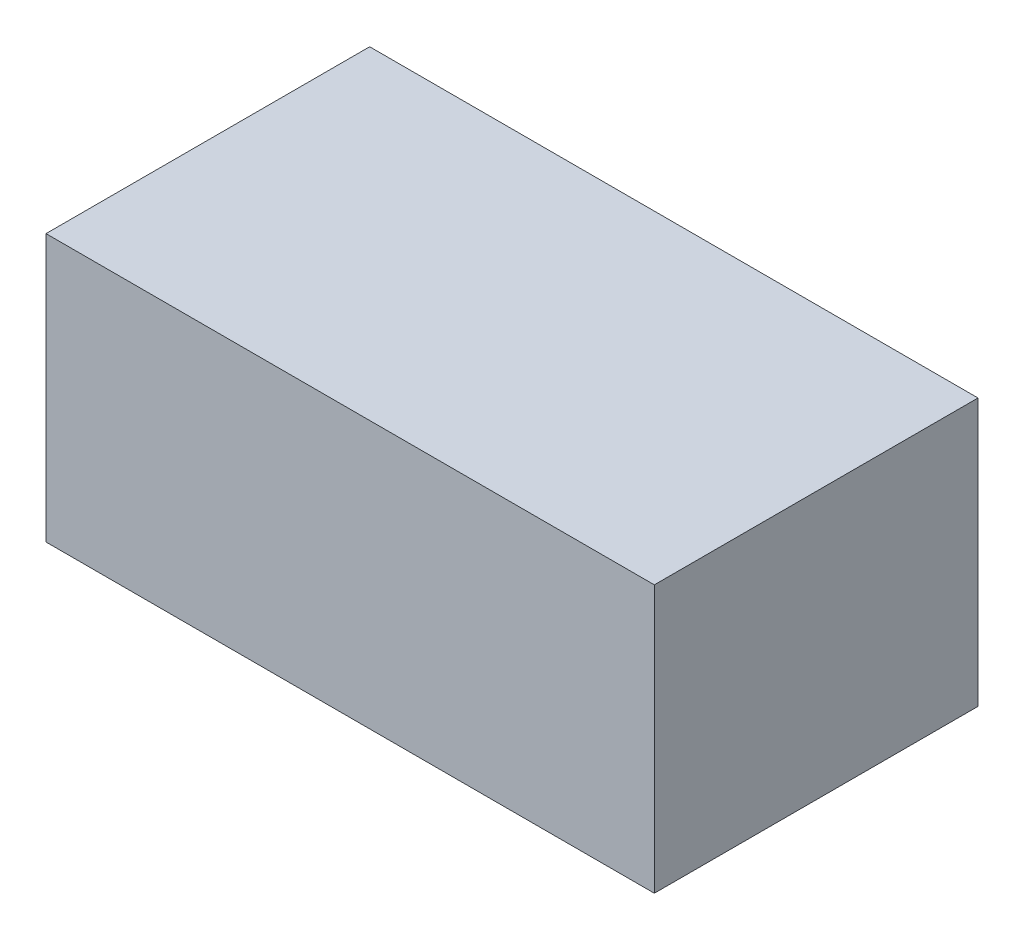
ISO-10303-21;
HEADER;
FILE_DESCRIPTION(('STEP AP214'),'2;1');
FILE_NAME('part.step','',(''),(''),'','','');
FILE_SCHEMA(('AUTOMOTIVE_DESIGN { 1 0 10303 214 1 1 1 1 }'));
ENDSEC;
DATA;
#1=APPLICATION_CONTEXT('core data for automotive mechanical design processes');
#2=APPLICATION_PROTOCOL_DEFINITION('international standard','automotive_design',2000,#1);
#3=PRODUCT_CONTEXT('',#1,'mechanical');
#4=PRODUCT('Part','Part','',(#3));
#5=PRODUCT_RELATED_PRODUCT_CATEGORY('part','',(#4));
#6=PRODUCT_DEFINITION_FORMATION('','',#4);
#7=PRODUCT_DEFINITION_CONTEXT('part definition',#1,'design');
#8=PRODUCT_DEFINITION('design','',#6,#7);
#9=PRODUCT_DEFINITION_SHAPE('','',#8);
#10=(LENGTH_UNIT() NAMED_UNIT(*) SI_UNIT(.MILLI.,.METRE.));
#11=(NAMED_UNIT(*) PLANE_ANGLE_UNIT() SI_UNIT($,.RADIAN.));
#12=(NAMED_UNIT(*) SI_UNIT($,.STERADIAN.) SOLID_ANGLE_UNIT());
#13=UNCERTAINTY_MEASURE_WITH_UNIT(LENGTH_MEASURE(1.E-05),#10,'distance_accuracy_value','');
#14=(GEOMETRIC_REPRESENTATION_CONTEXT(3) GLOBAL_UNCERTAINTY_ASSIGNED_CONTEXT((#13)) GLOBAL_UNIT_ASSIGNED_CONTEXT((#10,
#11,#12)) REPRESENTATION_CONTEXT('',''));
#15=CARTESIAN_POINT('',(0.,0.,0.));
#16=DIRECTION('',(0.,0.,1.));
#17=DIRECTION('',(1.,0.,0.));
#18=AXIS2_PLACEMENT_3D('',#15,#16,#17);
#19=CARTESIAN_POINT('',(14.2347417502107,18.75,-7.57332962138085));
#20=DIRECTION('',(0.,0.,-1.));
#21=DIRECTION('',(-1.,0.,0.));
#22=AXIS2_PLACEMENT_3D('',#19,#20,#21);
#23=PLANE('',#22);
#24=DIRECTION('',(1.,0.,0.));
#25=VECTOR('',#24,1.);
#26=CARTESIAN_POINT('',(14.2347417502107,6.25,-7.57332962138085));
#27=LINE('',#26,#25);
#28=CARTESIAN_POINT('',(14.2347417502107,6.25,-7.57332962138085));
#29=VERTEX_POINT('',#28);
#30=CARTESIAN_POINT('',(42.7042252506322,6.25,-7.57332962138085));
#31=VERTEX_POINT('',#30);
#32=EDGE_CURVE('E97',#29,#31,#27,.T.);
#33=ORIENTED_EDGE('',*,*,#32,.T.);
#34=DIRECTION('',(0.,-1.,0.));
#35=VECTOR('',#34,1.);
#36=CARTESIAN_POINT('',(42.7042252506322,18.75,-7.57332962138085));
#37=LINE('',#36,#35);
#38=CARTESIAN_POINT('',(42.7042252506322,18.75,-7.57332962138085));
#39=VERTEX_POINT('',#38);
#40=EDGE_CURVE('E11',#39,#31,#37,.T.);
#41=ORIENTED_EDGE('',*,*,#40,.F.);
#42=DIRECTION('',(1.,0.,0.));
#43=VECTOR('',#42,1.);
#44=CARTESIAN_POINT('',(14.2347417502107,18.75,-7.57332962138085));
#45=LINE('',#44,#43);
#46=CARTESIAN_POINT('',(14.2347417502107,18.75,-7.57332962138085));
#47=VERTEX_POINT('',#46);
#48=EDGE_CURVE('E83',#47,#39,#45,.T.);
#49=ORIENTED_EDGE('',*,*,#48,.F.);
#50=DIRECTION('',(0.,-1.,0.));
#51=VECTOR('',#50,1.);
#52=CARTESIAN_POINT('',(14.2347417502107,18.75,-7.57332962138085));
#53=LINE('',#52,#51);
#54=EDGE_CURVE('E50',#47,#29,#53,.T.);
#55=ORIENTED_EDGE('',*,*,#54,.T.);
#56=EDGE_LOOP('',(#33,#41,#49,#55));
#57=FACE_BOUND('',#56,.T.);
#58=ADVANCED_FACE('F34',(#57),#23,.F.);
#59=CARTESIAN_POINT('',(42.7042252506322,18.75,-7.57332962138085));
#60=DIRECTION('',(-1.,0.,0.));
#61=DIRECTION('',(0.,0.,1.));
#62=AXIS2_PLACEMENT_3D('',#59,#60,#61);
#63=PLANE('',#62);
#64=DIRECTION('',(0.,0.,-1.));
#65=VECTOR('',#64,1.);
#66=CARTESIAN_POINT('',(42.7042252506322,6.25,-7.57332962138085));
#67=LINE('',#66,#65);
#68=CARTESIAN_POINT('',(42.7042252506322,6.25,-22.7199888641425));
#69=VERTEX_POINT('',#68);
#70=EDGE_CURVE('E88',#31,#69,#67,.T.);
#71=ORIENTED_EDGE('',*,*,#70,.T.);
#72=DIRECTION('',(0.,-1.,0.));
#73=VECTOR('',#72,1.);
#74=CARTESIAN_POINT('',(42.7042252506322,18.75,-22.7199888641425));
#75=LINE('',#74,#73);
#76=CARTESIAN_POINT('',(42.7042252506322,18.75,-22.7199888641425));
#77=VERTEX_POINT('',#76);
#78=EDGE_CURVE('E42',#77,#69,#75,.T.);
#79=ORIENTED_EDGE('',*,*,#78,.F.);
#80=DIRECTION('',(0.,0.,-1.));
#81=VECTOR('',#80,1.);
#82=CARTESIAN_POINT('',(42.7042252506322,18.75,-7.57332962138085));
#83=LINE('',#82,#81);
#84=EDGE_CURVE('E75',#39,#77,#83,.T.);
#85=ORIENTED_EDGE('',*,*,#84,.F.);
#86=ORIENTED_EDGE('',*,*,#40,.T.);
#87=EDGE_LOOP('',(#71,#79,#85,#86));
#88=FACE_BOUND('',#87,.T.);
#89=ADVANCED_FACE('F87',(#88),#63,.F.);
#90=CARTESIAN_POINT('',(14.2347417502107,18.75,-22.7199888641425));
#91=DIRECTION('',(0.,0.,-1.));
#92=DIRECTION('',(-1.,0.,0.));
#93=AXIS2_PLACEMENT_3D('',#90,#91,#92);
#94=PLANE('',#93);
#95=DIRECTION('',(1.,0.,0.));
#96=VECTOR('',#95,1.);
#97=CARTESIAN_POINT('',(14.2347417502107,6.25,-22.7199888641425));
#98=LINE('',#97,#96);
#99=CARTESIAN_POINT('',(14.2347417502107,6.25,-22.7199888641425));
#100=VERTEX_POINT('',#99);
#101=EDGE_CURVE('E100',#100,#69,#98,.T.);
#102=ORIENTED_EDGE('',*,*,#101,.F.);
#103=DIRECTION('',(0.,-1.,0.));
#104=VECTOR('',#103,1.);
#105=CARTESIAN_POINT('',(14.2347417502107,18.75,-22.7199888641425));
#106=LINE('',#105,#104);
#107=CARTESIAN_POINT('',(14.2347417502107,18.75,-22.7199888641425));
#108=VERTEX_POINT('',#107);
#109=EDGE_CURVE('E64',#108,#100,#106,.T.);
#110=ORIENTED_EDGE('',*,*,#109,.F.);
#111=DIRECTION('',(1.,0.,0.));
#112=VECTOR('',#111,1.);
#113=CARTESIAN_POINT('',(14.2347417502107,18.75,-22.7199888641425));
#114=LINE('',#113,#112);
#115=EDGE_CURVE('E82',#108,#77,#114,.T.);
#116=ORIENTED_EDGE('',*,*,#115,.T.);
#117=ORIENTED_EDGE('',*,*,#78,.T.);
#118=EDGE_LOOP('',(#102,#110,#116,#117));
#119=FACE_BOUND('',#118,.T.);
#120=ADVANCED_FACE('F91',(#119),#94,.T.);
#121=CARTESIAN_POINT('',(14.2347417502107,18.75,-7.57332962138085));
#122=DIRECTION('',(-1.,0.,0.));
#123=DIRECTION('',(0.,0.,1.));
#124=AXIS2_PLACEMENT_3D('',#121,#122,#123);
#125=PLANE('',#124);
#126=DIRECTION('',(0.,0.,-1.));
#127=VECTOR('',#126,1.);
#128=CARTESIAN_POINT('',(14.2347417502107,6.25,-7.57332962138085));
#129=LINE('',#128,#127);
#130=EDGE_CURVE('E102',#29,#100,#129,.T.);
#131=ORIENTED_EDGE('',*,*,#130,.F.);
#132=ORIENTED_EDGE('',*,*,#54,.F.);
#133=DIRECTION('',(0.,0.,-1.));
#134=VECTOR('',#133,1.);
#135=CARTESIAN_POINT('',(14.2347417502107,18.75,-7.57332962138085));
#136=LINE('',#135,#134);
#137=EDGE_CURVE('E92',#47,#108,#136,.T.);
#138=ORIENTED_EDGE('',*,*,#137,.T.);
#139=ORIENTED_EDGE('',*,*,#109,.T.);
#140=EDGE_LOOP('',(#131,#132,#138,#139));
#141=FACE_BOUND('',#140,.T.);
#142=ADVANCED_FACE('F108',(#141),#125,.T.);
#143=CARTESIAN_POINT('',(14.2347417502107,18.75,-7.57332962138085));
#144=DIRECTION('',(0.,1.,0.));
#145=DIRECTION('',(0.,0.,1.));
#146=AXIS2_PLACEMENT_3D('',#143,#144,#145);
#147=PLANE('',#146);
#148=ORIENTED_EDGE('',*,*,#48,.T.);
#149=ORIENTED_EDGE('',*,*,#84,.T.);
#150=ORIENTED_EDGE('',*,*,#115,.F.);
#151=ORIENTED_EDGE('',*,*,#137,.F.);
#152=EDGE_LOOP('',(#148,#149,#150,#151));
#153=FACE_BOUND('',#152,.T.);
#154=ADVANCED_FACE('F79',(#153),#147,.T.);
#155=CARTESIAN_POINT('',(14.2347417502107,6.25,-7.57332962138085));
#156=DIRECTION('',(0.,1.,0.));
#157=DIRECTION('',(0.,0.,1.));
#158=AXIS2_PLACEMENT_3D('',#155,#156,#157);
#159=PLANE('',#158);
#160=ORIENTED_EDGE('',*,*,#32,.F.);
#161=ORIENTED_EDGE('',*,*,#130,.T.);
#162=ORIENTED_EDGE('',*,*,#101,.T.);
#163=ORIENTED_EDGE('',*,*,#70,.F.);
#164=EDGE_LOOP('',(#160,#161,#162,#163));
#165=FACE_BOUND('',#164,.T.);
#166=ADVANCED_FACE('F107',(#165),#159,.F.);
#167=CLOSED_SHELL('',(#58,#89,#120,#142,#154,#166));
#168=MANIFOLD_SOLID_BREP('B2',#167);
#169=ADVANCED_BREP_SHAPE_REPRESENTATION('',(#18,#168),#14);
#170=SHAPE_DEFINITION_REPRESENTATION(#9,#169);
ENDSEC;
END-ISO-10303-21;
